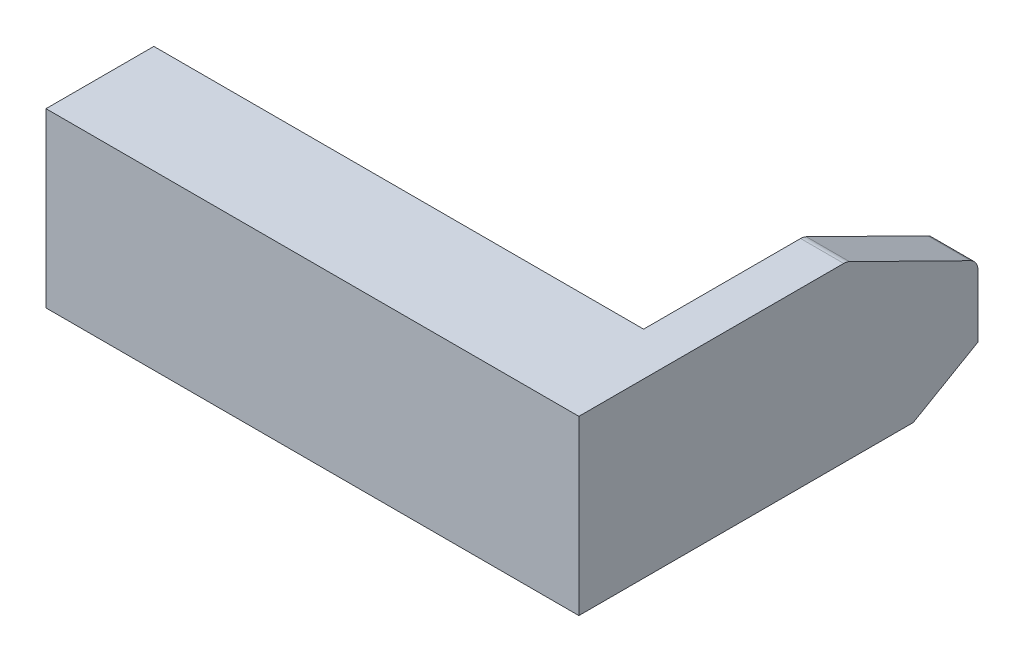
ISO-10303-21;
HEADER;
FILE_DESCRIPTION(('STEP AP214'),'2;1');
FILE_NAME('part.step','',(''),(''),'','','');
FILE_SCHEMA(('AUTOMOTIVE_DESIGN { 1 0 10303 214 1 1 1 1 }'));
ENDSEC;
DATA;
#1=APPLICATION_CONTEXT('core data for automotive mechanical design processes');
#2=APPLICATION_PROTOCOL_DEFINITION('international standard','automotive_design',2000,#1);
#3=PRODUCT_CONTEXT('',#1,'mechanical');
#4=PRODUCT('Part','Part','',(#3));
#5=PRODUCT_RELATED_PRODUCT_CATEGORY('part','',(#4));
#6=PRODUCT_DEFINITION_FORMATION('','',#4);
#7=PRODUCT_DEFINITION_CONTEXT('part definition',#1,'design');
#8=PRODUCT_DEFINITION('design','',#6,#7);
#9=PRODUCT_DEFINITION_SHAPE('','',#8);
#10=(LENGTH_UNIT() NAMED_UNIT(*) SI_UNIT(.MILLI.,.METRE.));
#11=(NAMED_UNIT(*) PLANE_ANGLE_UNIT() SI_UNIT($,.RADIAN.));
#12=(NAMED_UNIT(*) SI_UNIT($,.STERADIAN.) SOLID_ANGLE_UNIT());
#13=UNCERTAINTY_MEASURE_WITH_UNIT(LENGTH_MEASURE(1.E-05),#10,'distance_accuracy_value','');
#14=(GEOMETRIC_REPRESENTATION_CONTEXT(3) GLOBAL_UNCERTAINTY_ASSIGNED_CONTEXT((#13)) GLOBAL_UNIT_ASSIGNED_CONTEXT((#10,
#11,#12)) REPRESENTATION_CONTEXT('',''));
#15=CARTESIAN_POINT('',(0.,0.,0.));
#16=DIRECTION('',(0.,0.,1.));
#17=DIRECTION('',(1.,0.,0.));
#18=AXIS2_PLACEMENT_3D('',#15,#16,#17);
#19=CARTESIAN_POINT('',(0.,0.,0.));
#20=DIRECTION('',(1.,0.,0.));
#21=DIRECTION('',(0.,0.,-1.));
#22=AXIS2_PLACEMENT_3D('',#19,#20,#21);
#23=PLANE('',#22);
#24=CARTESIAN_POINT('',(0.,0.129573170731694,-35.5853658536586));
#25=DIRECTION('',(-1.,0.,0.));
#26=DIRECTION('',(0.,0.,1.));
#27=AXIS2_PLACEMENT_3D('',#24,#25,#26);
#28=CIRCLE('',#27,5.5);
#29=CARTESIAN_POINT('',(0.,0.129573170731694,-30.0853658536586));
#30=VERTEX_POINT('',#29);
#31=EDGE_CURVE('E242',#30,#30,#28,.T.);
#32=ORIENTED_EDGE('',*,*,#31,.F.);
#33=EDGE_LOOP('',(#32));
#34=FACE_BOUND('',#33,.T.);
#35=DIRECTION('',(0.,1.,0.));
#36=VECTOR('',#35,1.);
#37=CARTESIAN_POINT('',(0.,20.1295731707317,-56.5853658536586));
#38=LINE('',#37,#36);
#39=CARTESIAN_POINT('',(0.,-11.2101727914239,-56.5853658536586));
#40=VERTEX_POINT('',#39);
#41=CARTESIAN_POINT('',(0.,3.2640532905269,-56.5853658536586));
#42=VERTEX_POINT('',#41);
#43=EDGE_CURVE('E268',#40,#42,#38,.T.);
#44=ORIENTED_EDGE('',*,*,#43,.F.);
#45=DIRECTION('',(0.,0.499999999999998,-0.86602540378444));
#46=VECTOR('',#45,1.);
#47=CARTESIAN_POINT('',(0.,-11.2101727914239,-56.5853658536586));
#48=LINE('',#47,#46);
#49=CARTESIAN_POINT('',(0.,-19.8704268292683,-41.5853658536585));
#50=VERTEX_POINT('',#49);
#51=EDGE_CURVE('E79',#40,#50,#48,.F.);
#52=ORIENTED_EDGE('',*,*,#51,.T.);
#53=DIRECTION('',(0.,0.,-1.));
#54=VECTOR('',#53,1.);
#55=CARTESIAN_POINT('',(0.,-19.8704268292683,35.9146341463414));
#56=LINE('',#55,#54);
#57=CARTESIAN_POINT('',(0.,-19.8704268292683,10.9146341463414));
#58=VERTEX_POINT('',#57);
#59=EDGE_CURVE('E247',#58,#50,#56,.T.);
#60=ORIENTED_EDGE('',*,*,#59,.F.);
#61=DIRECTION('',(0.,-1.,0.));
#62=VECTOR('',#61,1.);
#63=CARTESIAN_POINT('',(0.,20.1295731707317,10.9146341463414));
#64=LINE('',#63,#62);
#65=CARTESIAN_POINT('',(0.,20.1295731707317,10.9146341463414));
#66=VERTEX_POINT('',#65);
#67=EDGE_CURVE('E180',#66,#58,#64,.T.);
#68=ORIENTED_EDGE('',*,*,#67,.F.);
#69=DIRECTION('',(0.,0.,1.));
#70=VECTOR('',#69,1.);
#71=CARTESIAN_POINT('',(0.,20.1295731707317,35.9146341463414));
#72=LINE('',#71,#70);
#73=CARTESIAN_POINT('',(0.,20.1295731707317,-25.4688729323097));
#74=VERTEX_POINT('',#73);
#75=EDGE_CURVE('E256',#74,#66,#72,.T.);
#76=ORIENTED_EDGE('',*,*,#75,.F.);
#77=CARTESIAN_POINT('',(0.,17.1295731707317,-25.4688729323097));
#78=DIRECTION('',(1.,0.,0.));
#79=DIRECTION('',(0.,0.,-1.));
#80=AXIS2_PLACEMENT_3D('',#77,#78,#79);
#81=CIRCLE('',#80,3.);
#82=CARTESIAN_POINT('',(0.,19.8201913953298,-26.7957390029667));
#83=VERTEX_POINT('',#82);
#84=EDGE_CURVE('E328',#74,#83,#81,.F.);
#85=ORIENTED_EDGE('',*,*,#84,.T.);
#86=DIRECTION('',(0.,0.442288690219003,0.896872741532688));
#87=VECTOR('',#86,1.);
#88=CARTESIAN_POINT('',(0.,20.1295731707317,-26.1683748238203));
#89=LINE('',#88,#87);
#90=CARTESIAN_POINT('',(0.,5.95467151512495,-54.9122319243156));
#91=VERTEX_POINT('',#90);
#92=EDGE_CURVE('E303',#83,#91,#89,.F.);
#93=ORIENTED_EDGE('',*,*,#92,.T.);
#94=CARTESIAN_POINT('',(0.,3.2640532905269,-53.5853658536586));
#95=DIRECTION('',(1.,0.,0.));
#96=DIRECTION('',(0.,0.,-1.));
#97=AXIS2_PLACEMENT_3D('',#94,#95,#96);
#98=CIRCLE('',#97,3.);
#99=EDGE_CURVE('E324',#91,#42,#98,.F.);
#100=ORIENTED_EDGE('',*,*,#99,.T.);
#101=EDGE_LOOP('',(#44,#52,#60,#68,#76,#85,#93,#100));
#102=FACE_BOUND('',#101,.T.);
#103=ADVANCED_FACE('F55',(#34,#102),#23,.F.);
#104=CARTESIAN_POINT('',(10.,20.1295731707317,35.9146341463414));
#105=DIRECTION('',(0.,0.,-1.));
#106=DIRECTION('',(0.,1.,0.));
#107=AXIS2_PLACEMENT_3D('',#104,#105,#106);
#108=PLANE('',#107);
#109=DIRECTION('',(-1.,0.,0.));
#110=VECTOR('',#109,1.);
#111=CARTESIAN_POINT('',(10.,20.1295731707317,35.9146341463414));
#112=LINE('',#111,#110);
#113=CARTESIAN_POINT('',(10.,20.1295731707317,35.9146341463414));
#114=VERTEX_POINT('',#113);
#115=CARTESIAN_POINT('',(-113.5,20.1295731707317,35.9146341463414));
#116=VERTEX_POINT('',#115);
#117=EDGE_CURVE('E265',#114,#116,#112,.T.);
#118=ORIENTED_EDGE('',*,*,#117,.T.);
#119=DIRECTION('',(0.,1.,0.));
#120=VECTOR('',#119,1.);
#121=CARTESIAN_POINT('',(-113.5,20.1295731707317,35.9146341463414));
#122=LINE('',#121,#120);
#123=CARTESIAN_POINT('',(-113.5,-19.8704268292683,35.9146341463414));
#124=VERTEX_POINT('',#123);
#125=EDGE_CURVE('E224',#124,#116,#122,.T.);
#126=ORIENTED_EDGE('',*,*,#125,.F.);
#127=DIRECTION('',(-1.,0.,0.));
#128=VECTOR('',#127,1.);
#129=CARTESIAN_POINT('',(10.,-19.8704268292683,35.9146341463414));
#130=LINE('',#129,#128);
#131=CARTESIAN_POINT('',(10.,-19.8704268292683,35.9146341463414));
#132=VERTEX_POINT('',#131);
#133=EDGE_CURVE('E275',#132,#124,#130,.T.);
#134=ORIENTED_EDGE('',*,*,#133,.F.);
#135=DIRECTION('',(0.,-1.,0.));
#136=VECTOR('',#135,1.);
#137=CARTESIAN_POINT('',(10.,20.1295731707317,35.9146341463414));
#138=LINE('',#137,#136);
#139=EDGE_CURVE('E251',#114,#132,#138,.T.);
#140=ORIENTED_EDGE('',*,*,#139,.F.);
#141=EDGE_LOOP('',(#118,#126,#134,#140));
#142=FACE_BOUND('',#141,.T.);
#143=ADVANCED_FACE('F387',(#142),#108,.F.);
#144=CARTESIAN_POINT('',(10.,-19.8704268292683,35.9146341463414));
#145=DIRECTION('',(0.,1.,0.));
#146=DIRECTION('',(0.,0.,1.));
#147=AXIS2_PLACEMENT_3D('',#144,#145,#146);
#148=PLANE('',#147);
#149=ORIENTED_EDGE('',*,*,#59,.T.);
#150=DIRECTION('',(1.,0.,0.));
#151=VECTOR('',#150,1.);
#152=CARTESIAN_POINT('',(10.,-19.8704268292683,-41.5853658536585));
#153=LINE('',#152,#151);
#154=CARTESIAN_POINT('',(10.,-19.8704268292683,-41.5853658536585));
#155=VERTEX_POINT('',#154);
#156=EDGE_CURVE('E65',#50,#155,#153,.T.);
#157=ORIENTED_EDGE('',*,*,#156,.T.);
#158=DIRECTION('',(0.,0.,-1.));
#159=VECTOR('',#158,1.);
#160=CARTESIAN_POINT('',(10.,-19.8704268292683,35.9146341463414));
#161=LINE('',#160,#159);
#162=EDGE_CURVE('E255',#132,#155,#161,.T.);
#163=ORIENTED_EDGE('',*,*,#162,.F.);
#164=ORIENTED_EDGE('',*,*,#133,.T.);
#165=DIRECTION('',(0.,0.,1.));
#166=VECTOR('',#165,1.);
#167=CARTESIAN_POINT('',(-113.5,-19.8704268292683,10.9146341463414));
#168=LINE('',#167,#166);
#169=CARTESIAN_POINT('',(-113.5,-19.8704268292683,10.9146341463414));
#170=VERTEX_POINT('',#169);
#171=EDGE_CURVE('E220',#170,#124,#168,.T.);
#172=ORIENTED_EDGE('',*,*,#171,.F.);
#173=DIRECTION('',(1.,0.,0.));
#174=VECTOR('',#173,1.);
#175=CARTESIAN_POINT('',(-113.5,-19.8704268292683,10.9146341463414));
#176=LINE('',#175,#174);
#177=EDGE_CURVE('E238',#170,#58,#176,.T.);
#178=ORIENTED_EDGE('',*,*,#177,.T.);
#179=EDGE_LOOP('',(#149,#157,#163,#164,#172,#178));
#180=FACE_BOUND('',#179,.T.);
#181=ADVANCED_FACE('F400',(#180),#148,.F.);
#182=CARTESIAN_POINT('',(10.,20.1295731707317,-56.5853658536586));
#183=DIRECTION('',(0.,0.,1.));
#184=DIRECTION('',(1.,0.,0.));
#185=AXIS2_PLACEMENT_3D('',#182,#183,#184);
#186=PLANE('',#185);
#187=DIRECTION('',(0.,1.,0.));
#188=VECTOR('',#187,1.);
#189=CARTESIAN_POINT('',(10.,20.1295731707317,-56.5853658536586));
#190=LINE('',#189,#188);
#191=CARTESIAN_POINT('',(10.,-11.2101727914239,-56.5853658536586));
#192=VERTEX_POINT('',#191);
#193=CARTESIAN_POINT('',(10.,3.2640532905269,-56.5853658536586));
#194=VERTEX_POINT('',#193);
#195=EDGE_CURVE('E259',#192,#194,#190,.T.);
#196=ORIENTED_EDGE('',*,*,#195,.F.);
#197=DIRECTION('',(-1.,0.,0.));
#198=VECTOR('',#197,1.);
#199=CARTESIAN_POINT('',(10.,-11.2101727914239,-56.5853658536586));
#200=LINE('',#199,#198);
#201=EDGE_CURVE('E347',#192,#40,#200,.T.);
#202=ORIENTED_EDGE('',*,*,#201,.T.);
#203=ORIENTED_EDGE('',*,*,#43,.T.);
#204=DIRECTION('',(-1.,0.,0.));
#205=VECTOR('',#204,1.);
#206=CARTESIAN_POINT('',(10.,3.2640532905269,-56.5853658536586));
#207=LINE('',#206,#205);
#208=EDGE_CURVE('E343',#42,#194,#207,.F.);
#209=ORIENTED_EDGE('',*,*,#208,.T.);
#210=EDGE_LOOP('',(#196,#202,#203,#209));
#211=FACE_BOUND('',#210,.T.);
#212=ADVANCED_FACE('F356',(#211),#186,.F.);
#213=CARTESIAN_POINT('',(10.,20.1295731707317,35.9146341463414));
#214=DIRECTION('',(0.,-1.,0.));
#215=DIRECTION('',(0.,0.,-1.));
#216=AXIS2_PLACEMENT_3D('',#213,#214,#215);
#217=PLANE('',#216);
#218=DIRECTION('',(0.,0.,1.));
#219=VECTOR('',#218,1.);
#220=CARTESIAN_POINT('',(10.,20.1295731707317,35.9146341463414));
#221=LINE('',#220,#219);
#222=CARTESIAN_POINT('',(10.,20.1295731707317,-25.4688729323097));
#223=VERTEX_POINT('',#222);
#224=EDGE_CURVE('E262',#223,#114,#221,.T.);
#225=ORIENTED_EDGE('',*,*,#224,.F.);
#226=DIRECTION('',(1.,0.,0.));
#227=VECTOR('',#226,1.);
#228=CARTESIAN_POINT('',(0.,20.1295731707317,-25.4688729323097));
#229=LINE('',#228,#227);
#230=EDGE_CURVE('E320',#223,#74,#229,.F.);
#231=ORIENTED_EDGE('',*,*,#230,.T.);
#232=ORIENTED_EDGE('',*,*,#75,.T.);
#233=DIRECTION('',(1.,0.,0.));
#234=VECTOR('',#233,1.);
#235=CARTESIAN_POINT('',(-113.5,20.1295731707317,10.9146341463414));
#236=LINE('',#235,#234);
#237=CARTESIAN_POINT('',(-113.5,20.1295731707317,10.9146341463414));
#238=VERTEX_POINT('',#237);
#239=EDGE_CURVE('E231',#238,#66,#236,.T.);
#240=ORIENTED_EDGE('',*,*,#239,.F.);
#241=DIRECTION('',(0.,0.,-1.));
#242=VECTOR('',#241,1.);
#243=CARTESIAN_POINT('',(-113.5,20.1295731707317,10.9146341463414));
#244=LINE('',#243,#242);
#245=EDGE_CURVE('E228',#116,#238,#244,.T.);
#246=ORIENTED_EDGE('',*,*,#245,.F.);
#247=ORIENTED_EDGE('',*,*,#117,.F.);
#248=EDGE_LOOP('',(#225,#231,#232,#240,#246,#247));
#249=FACE_BOUND('',#248,.T.);
#250=ADVANCED_FACE('F379',(#249),#217,.F.);
#251=CARTESIAN_POINT('',(10.,0.,0.));
#252=DIRECTION('',(1.,0.,0.));
#253=DIRECTION('',(0.,0.,-1.));
#254=AXIS2_PLACEMENT_3D('',#251,#252,#253);
#255=PLANE('',#254);
#256=ORIENTED_EDGE('',*,*,#162,.T.);
#257=DIRECTION('',(0.,-0.499999999999998,0.86602540378444));
#258=VECTOR('',#257,1.);
#259=CARTESIAN_POINT('',(10.,-32.9098117494203,-19.0004886725076));
#260=LINE('',#259,#258);
#261=EDGE_CURVE('E11',#155,#192,#260,.F.);
#262=ORIENTED_EDGE('',*,*,#261,.T.);
#263=ORIENTED_EDGE('',*,*,#195,.T.);
#264=CARTESIAN_POINT('',(10.,3.2640532905269,-53.5853658536586));
#265=DIRECTION('',(1.,0.,0.));
#266=DIRECTION('',(0.,0.,-1.));
#267=AXIS2_PLACEMENT_3D('',#264,#265,#266);
#268=CIRCLE('',#267,3.);
#269=CARTESIAN_POINT('',(10.,5.95467151512495,-54.9122319243156));
#270=VERTEX_POINT('',#269);
#271=EDGE_CURVE('E337',#194,#270,#268,.T.);
#272=ORIENTED_EDGE('',*,*,#271,.T.);
#273=DIRECTION('',(0.,-0.442288690219003,-0.896872741532688));
#274=VECTOR('',#273,1.);
#275=CARTESIAN_POINT('',(10.,26.5722242379764,-13.1039708424363));
#276=LINE('',#275,#274);
#277=CARTESIAN_POINT('',(10.,19.8201913953298,-26.7957390029667));
#278=VERTEX_POINT('',#277);
#279=EDGE_CURVE('E316',#270,#278,#276,.F.);
#280=ORIENTED_EDGE('',*,*,#279,.T.);
#281=CARTESIAN_POINT('',(10.,17.1295731707317,-25.4688729323097));
#282=DIRECTION('',(1.,0.,0.));
#283=DIRECTION('',(0.,0.,-1.));
#284=AXIS2_PLACEMENT_3D('',#281,#282,#283);
#285=CIRCLE('',#284,3.);
#286=EDGE_CURVE('E340',#278,#223,#285,.T.);
#287=ORIENTED_EDGE('',*,*,#286,.T.);
#288=ORIENTED_EDGE('',*,*,#224,.T.);
#289=ORIENTED_EDGE('',*,*,#139,.T.);
#290=EDGE_LOOP('',(#256,#262,#263,#272,#280,#287,#288,#289));
#291=FACE_BOUND('',#290,.T.);
#292=ADVANCED_FACE('F368',(#291),#255,.T.);
#293=CARTESIAN_POINT('',(8.5,0.129573170731694,-35.5853658536586));
#294=DIRECTION('',(-1.,0.,0.));
#295=DIRECTION('',(0.,0.,1.));
#296=AXIS2_PLACEMENT_3D('',#293,#294,#295);
#297=CYLINDRICAL_SURFACE('',#296,5.5);
#298=CARTESIAN_POINT('',(8.5,0.129573170731694,-35.5853658536586));
#299=DIRECTION('',(-1.,0.,0.));
#300=DIRECTION('',(0.,0.,1.));
#301=AXIS2_PLACEMENT_3D('',#298,#299,#300);
#302=CIRCLE('',#301,5.5);
#303=CARTESIAN_POINT('',(8.5,0.129573170731694,-30.0853658536586));
#304=VERTEX_POINT('',#303);
#305=EDGE_CURVE('E243',#304,#304,#302,.T.);
#306=ORIENTED_EDGE('',*,*,#305,.F.);
#307=EDGE_LOOP('',(#306));
#308=FACE_BOUND('',#307,.T.);
#309=ORIENTED_EDGE('',*,*,#31,.T.);
#310=EDGE_LOOP('',(#309));
#311=FACE_BOUND('',#310,.T.);
#312=ADVANCED_FACE('F440',(#308,#311),#297,.F.);
#313=CARTESIAN_POINT('',(8.5,0.129573170731694,-35.5853658536586));
#314=DIRECTION('',(-1.,0.,0.));
#315=DIRECTION('',(0.,0.,1.));
#316=AXIS2_PLACEMENT_3D('',#313,#314,#315);
#317=PLANE('',#316);
#318=ORIENTED_EDGE('',*,*,#305,.T.);
#319=EDGE_LOOP('',(#318));
#320=FACE_BOUND('',#319,.T.);
#321=ADVANCED_FACE('F434',(#320),#317,.T.);
#322=CARTESIAN_POINT('',(-113.5,0.,0.));
#323=DIRECTION('',(-1.,0.,0.));
#324=DIRECTION('',(0.,0.,1.));
#325=AXIS2_PLACEMENT_3D('',#322,#323,#324);
#326=PLANE('',#325);
#327=DIRECTION('',(0.,1.,0.));
#328=VECTOR('',#327,1.);
#329=CARTESIAN_POINT('',(-113.5,0.,31.5396341463414));
#330=LINE('',#329,#328);
#331=CARTESIAN_POINT('',(-113.5,15.7545731707317,31.5396341463414));
#332=VERTEX_POINT('',#331);
#333=CARTESIAN_POINT('',(-113.5,-15.4954268292683,31.5396341463414));
#334=VERTEX_POINT('',#333);
#335=EDGE_CURVE('E288',#332,#334,#330,.F.);
#336=ORIENTED_EDGE('',*,*,#335,.T.);
#337=DIRECTION('',(0.,0.,1.));
#338=VECTOR('',#337,1.);
#339=CARTESIAN_POINT('',(-113.5,-15.4954268292683,0.));
#340=LINE('',#339,#338);
#341=CARTESIAN_POINT('',(-113.5,-15.4954268292683,15.2896341463414));
#342=VERTEX_POINT('',#341);
#343=EDGE_CURVE('E291',#334,#342,#340,.F.);
#344=ORIENTED_EDGE('',*,*,#343,.T.);
#345=DIRECTION('',(0.,-1.,0.));
#346=VECTOR('',#345,1.);
#347=CARTESIAN_POINT('',(-113.5,0.,15.2896341463414));
#348=LINE('',#347,#346);
#349=CARTESIAN_POINT('',(-113.5,15.7545731707317,15.2896341463414));
#350=VERTEX_POINT('',#349);
#351=EDGE_CURVE('E282',#342,#350,#348,.F.);
#352=ORIENTED_EDGE('',*,*,#351,.T.);
#353=DIRECTION('',(0.,0.,-1.));
#354=VECTOR('',#353,1.);
#355=CARTESIAN_POINT('',(-113.5,15.7545731707317,0.));
#356=LINE('',#355,#354);
#357=EDGE_CURVE('E285',#350,#332,#356,.F.);
#358=ORIENTED_EDGE('',*,*,#357,.T.);
#359=EDGE_LOOP('',(#336,#344,#352,#358));
#360=FACE_BOUND('',#359,.T.);
#361=DIRECTION('',(0.,-1.,0.));
#362=VECTOR('',#361,1.);
#363=CARTESIAN_POINT('',(-113.5,20.1295731707317,10.9146341463414));
#364=LINE('',#363,#362);
#365=EDGE_CURVE('E216',#238,#170,#364,.T.);
#366=ORIENTED_EDGE('',*,*,#365,.T.);
#367=ORIENTED_EDGE('',*,*,#171,.T.);
#368=ORIENTED_EDGE('',*,*,#125,.T.);
#369=ORIENTED_EDGE('',*,*,#245,.T.);
#370=EDGE_LOOP('',(#366,#367,#368,#369));
#371=FACE_BOUND('',#370,.T.);
#372=ADVANCED_FACE('F432',(#360,#371),#326,.T.);
#373=CARTESIAN_POINT('',(-113.5,20.1295731707317,10.9146341463414));
#374=DIRECTION('',(0.,0.,1.));
#375=DIRECTION('',(0.,-1.,0.));
#376=AXIS2_PLACEMENT_3D('',#373,#374,#375);
#377=PLANE('',#376);
#378=ORIENTED_EDGE('',*,*,#67,.T.);
#379=ORIENTED_EDGE('',*,*,#177,.F.);
#380=ORIENTED_EDGE('',*,*,#365,.F.);
#381=ORIENTED_EDGE('',*,*,#239,.T.);
#382=EDGE_LOOP('',(#378,#379,#380,#381));
#383=FACE_BOUND('',#382,.T.);
#384=ADVANCED_FACE('F431',(#383),#377,.F.);
#385=CARTESIAN_POINT('',(-113.5,12.7545731707317,18.2896341463414));
#386=DIRECTION('',(0.,-1.,0.));
#387=DIRECTION('',(0.,0.,-1.));
#388=AXIS2_PLACEMENT_3D('',#385,#386,#387);
#389=PLANE('',#388);
#390=DIRECTION('',(1.,0.,0.));
#391=VECTOR('',#390,1.);
#392=CARTESIAN_POINT('',(-113.5,12.7545731707317,28.5396341463414));
#393=LINE('',#392,#391);
#394=CARTESIAN_POINT('',(-110.5,12.7545731707317,28.5396341463414));
#395=VERTEX_POINT('',#394);
#396=CARTESIAN_POINT('',(0.,12.7545731707317,28.5396341463414));
#397=VERTEX_POINT('',#396);
#398=EDGE_CURVE('E208',#395,#397,#393,.T.);
#399=ORIENTED_EDGE('',*,*,#398,.F.);
#400=DIRECTION('',(0.,0.,-1.));
#401=VECTOR('',#400,1.);
#402=CARTESIAN_POINT('',(-110.5,12.7545731707317,18.2896341463414));
#403=LINE('',#402,#401);
#404=CARTESIAN_POINT('',(-110.5,12.7545731707317,18.2896341463414));
#405=VERTEX_POINT('',#404);
#406=EDGE_CURVE('E176',#395,#405,#403,.T.);
#407=ORIENTED_EDGE('',*,*,#406,.T.);
#408=DIRECTION('',(1.,0.,0.));
#409=VECTOR('',#408,1.);
#410=CARTESIAN_POINT('',(-113.5,12.7545731707317,18.2896341463414));
#411=LINE('',#410,#409);
#412=CARTESIAN_POINT('',(0.,12.7545731707317,18.2896341463414));
#413=VERTEX_POINT('',#412);
#414=EDGE_CURVE('E168',#405,#413,#411,.T.);
#415=ORIENTED_EDGE('',*,*,#414,.T.);
#416=DIRECTION('',(0.,0.,-1.));
#417=VECTOR('',#416,1.);
#418=CARTESIAN_POINT('',(0.,12.7545731707317,18.2896341463414));
#419=LINE('',#418,#417);
#420=EDGE_CURVE('E173',#397,#413,#419,.T.);
#421=ORIENTED_EDGE('',*,*,#420,.F.);
#422=EDGE_LOOP('',(#399,#407,#415,#421));
#423=FACE_BOUND('',#422,.T.);
#424=ADVANCED_FACE('F171',(#423),#389,.T.);
#425=CARTESIAN_POINT('',(-113.5,12.7545731707317,18.2896341463414));
#426=DIRECTION('',(0.,0.,1.));
#427=DIRECTION('',(0.,-1.,0.));
#428=AXIS2_PLACEMENT_3D('',#425,#426,#427);
#429=PLANE('',#428);
#430=ORIENTED_EDGE('',*,*,#414,.F.);
#431=DIRECTION('',(0.,-1.,0.));
#432=VECTOR('',#431,1.);
#433=CARTESIAN_POINT('',(-110.5,12.7545731707317,18.2896341463414));
#434=LINE('',#433,#432);
#435=CARTESIAN_POINT('',(-110.5,-12.4954268292683,18.2896341463414));
#436=VERTEX_POINT('',#435);
#437=EDGE_CURVE('E300',#405,#436,#434,.T.);
#438=ORIENTED_EDGE('',*,*,#437,.T.);
#439=DIRECTION('',(1.,0.,0.));
#440=VECTOR('',#439,1.);
#441=CARTESIAN_POINT('',(-113.5,-12.4954268292683,18.2896341463414));
#442=LINE('',#441,#440);
#443=CARTESIAN_POINT('',(0.,-12.4954268292683,18.2896341463414));
#444=VERTEX_POINT('',#443);
#445=EDGE_CURVE('E181',#436,#444,#442,.T.);
#446=ORIENTED_EDGE('',*,*,#445,.T.);
#447=DIRECTION('',(0.,-1.,0.));
#448=VECTOR('',#447,1.);
#449=CARTESIAN_POINT('',(0.,12.7545731707317,18.2896341463414));
#450=LINE('',#449,#448);
#451=EDGE_CURVE('E184',#413,#444,#450,.T.);
#452=ORIENTED_EDGE('',*,*,#451,.F.);
#453=EDGE_LOOP('',(#430,#438,#446,#452));
#454=FACE_BOUND('',#453,.T.);
#455=ADVANCED_FACE('F185',(#454),#429,.T.);
#456=CARTESIAN_POINT('',(-113.5,-12.4954268292683,18.2896341463414));
#457=DIRECTION('',(0.,1.,0.));
#458=DIRECTION('',(0.,0.,1.));
#459=AXIS2_PLACEMENT_3D('',#456,#457,#458);
#460=PLANE('',#459);
#461=ORIENTED_EDGE('',*,*,#445,.F.);
#462=DIRECTION('',(0.,0.,1.));
#463=VECTOR('',#462,1.);
#464=CARTESIAN_POINT('',(-110.5,-12.4954268292683,18.2896341463414));
#465=LINE('',#464,#463);
#466=CARTESIAN_POINT('',(-110.5,-12.4954268292683,28.5396341463414));
#467=VERTEX_POINT('',#466);
#468=EDGE_CURVE('E278',#436,#467,#465,.T.);
#469=ORIENTED_EDGE('',*,*,#468,.T.);
#470=DIRECTION('',(1.,0.,0.));
#471=VECTOR('',#470,1.);
#472=CARTESIAN_POINT('',(-113.5,-12.4954268292683,28.5396341463414));
#473=LINE('',#472,#471);
#474=CARTESIAN_POINT('',(0.,-12.4954268292683,28.5396341463414));
#475=VERTEX_POINT('',#474);
#476=EDGE_CURVE('E211',#467,#475,#473,.T.);
#477=ORIENTED_EDGE('',*,*,#476,.T.);
#478=DIRECTION('',(0.,0.,1.));
#479=VECTOR('',#478,1.);
#480=CARTESIAN_POINT('',(0.,-12.4954268292683,18.2896341463414));
#481=LINE('',#480,#479);
#482=EDGE_CURVE('E191',#444,#475,#481,.T.);
#483=ORIENTED_EDGE('',*,*,#482,.F.);
#484=EDGE_LOOP('',(#461,#469,#477,#483));
#485=FACE_BOUND('',#484,.T.);
#486=ADVANCED_FACE('F417',(#485),#460,.T.);
#487=CARTESIAN_POINT('',(-113.5,12.7545731707317,28.5396341463414));
#488=DIRECTION('',(0.,0.,-1.));
#489=DIRECTION('',(0.,1.,0.));
#490=AXIS2_PLACEMENT_3D('',#487,#488,#489);
#491=PLANE('',#490);
#492=ORIENTED_EDGE('',*,*,#476,.F.);
#493=DIRECTION('',(0.,1.,0.));
#494=VECTOR('',#493,1.);
#495=CARTESIAN_POINT('',(-110.5,12.7545731707317,28.5396341463414));
#496=LINE('',#495,#494);
#497=EDGE_CURVE('E295',#467,#395,#496,.T.);
#498=ORIENTED_EDGE('',*,*,#497,.T.);
#499=ORIENTED_EDGE('',*,*,#398,.T.);
#500=DIRECTION('',(0.,1.,0.));
#501=VECTOR('',#500,1.);
#502=CARTESIAN_POINT('',(0.,12.7545731707317,28.5396341463414));
#503=LINE('',#502,#501);
#504=EDGE_CURVE('E195',#475,#397,#503,.T.);
#505=ORIENTED_EDGE('',*,*,#504,.F.);
#506=EDGE_LOOP('',(#492,#498,#499,#505));
#507=FACE_BOUND('',#506,.T.);
#508=ADVANCED_FACE('F407',(#507),#491,.T.);
#509=ORIENTED_EDGE('',*,*,#504,.T.);
#510=ORIENTED_EDGE('',*,*,#420,.T.);
#511=ORIENTED_EDGE('',*,*,#451,.T.);
#512=ORIENTED_EDGE('',*,*,#482,.T.);
#513=EDGE_LOOP('',(#509,#510,#511,#512));
#514=FACE_BOUND('',#513,.T.);
#515=ADVANCED_FACE('F193',(#514),#23,.F.);
#516=CARTESIAN_POINT('',(-110.5,15.7545731707317,18.2896341463414));
#517=DIRECTION('',(0.,0.,-1.));
#518=DIRECTION('',(-1.,0.,0.));
#519=AXIS2_PLACEMENT_3D('',#516,#517,#518);
#520=CYLINDRICAL_SURFACE('',#519,3.);
#521=CARTESIAN_POINT('',(-110.5,15.7545731707317,31.5396341463414));
#522=DIRECTION('',(0.,0.707106781186547,-0.707106781186548));
#523=DIRECTION('',(0.,0.707106781186548,0.707106781186547));
#524=AXIS2_PLACEMENT_3D('',#521,#522,#523);
#525=ELLIPSE('',#524,4.24264068711928,3.);
#526=EDGE_CURVE('E201',#332,#395,#525,.F.);
#527=ORIENTED_EDGE('',*,*,#526,.F.);
#528=ORIENTED_EDGE('',*,*,#357,.F.);
#529=CARTESIAN_POINT('',(-110.5,15.7545731707317,15.2896341463414));
#530=DIRECTION('',(0.,-0.707106781186548,-0.707106781186547));
#531=DIRECTION('',(0.,0.707106781186547,-0.707106781186548));
#532=AXIS2_PLACEMENT_3D('',#529,#530,#531);
#533=ELLIPSE('',#532,4.24264068711929,3.);
#534=EDGE_CURVE('E197',#405,#350,#533,.T.);
#535=ORIENTED_EDGE('',*,*,#534,.F.);
#536=ORIENTED_EDGE('',*,*,#406,.F.);
#537=EDGE_LOOP('',(#527,#528,#535,#536));
#538=FACE_BOUND('',#537,.T.);
#539=ADVANCED_FACE('F406',(#538),#520,.T.);
#540=CARTESIAN_POINT('',(-110.5,12.7545731707317,15.2896341463414));
#541=DIRECTION('',(0.,-1.,0.));
#542=DIRECTION('',(0.,0.,-1.));
#543=AXIS2_PLACEMENT_3D('',#540,#541,#542);
#544=CYLINDRICAL_SURFACE('',#543,3.);
#545=ORIENTED_EDGE('',*,*,#534,.T.);
#546=ORIENTED_EDGE('',*,*,#351,.F.);
#547=CARTESIAN_POINT('',(-110.5,-15.4954268292683,15.2896341463414));
#548=DIRECTION('',(0.,-0.707106781186547,0.707106781186548));
#549=DIRECTION('',(0.,0.707106781186548,0.707106781186547));
#550=AXIS2_PLACEMENT_3D('',#547,#548,#549);
#551=ELLIPSE('',#550,4.24264068711928,3.);
#552=EDGE_CURVE('E307',#436,#342,#551,.T.);
#553=ORIENTED_EDGE('',*,*,#552,.F.);
#554=ORIENTED_EDGE('',*,*,#437,.F.);
#555=EDGE_LOOP('',(#545,#546,#553,#554));
#556=FACE_BOUND('',#555,.T.);
#557=ADVANCED_FACE('F413',(#556),#544,.T.);
#558=CARTESIAN_POINT('',(-110.5,12.7545731707317,31.5396341463414));
#559=DIRECTION('',(0.,1.,0.));
#560=DIRECTION('',(0.,0.,1.));
#561=AXIS2_PLACEMENT_3D('',#558,#559,#560);
#562=CYLINDRICAL_SURFACE('',#561,3.);
#563=ORIENTED_EDGE('',*,*,#526,.T.);
#564=ORIENTED_EDGE('',*,*,#497,.F.);
#565=CARTESIAN_POINT('',(-110.5,-15.4954268292683,31.5396341463414));
#566=DIRECTION('',(0.,0.707106781186548,0.707106781186547));
#567=DIRECTION('',(0.,-0.707106781186547,0.707106781186548));
#568=AXIS2_PLACEMENT_3D('',#565,#566,#567);
#569=ELLIPSE('',#568,4.24264068711929,3.);
#570=EDGE_CURVE('E304',#334,#467,#569,.F.);
#571=ORIENTED_EDGE('',*,*,#570,.F.);
#572=ORIENTED_EDGE('',*,*,#335,.F.);
#573=EDGE_LOOP('',(#563,#564,#571,#572));
#574=FACE_BOUND('',#573,.T.);
#575=ADVANCED_FACE('F458',(#574),#562,.T.);
#576=CARTESIAN_POINT('',(-110.5,-15.4954268292683,18.2896341463414));
#577=DIRECTION('',(0.,0.,1.));
#578=DIRECTION('',(1.,0.,0.));
#579=AXIS2_PLACEMENT_3D('',#576,#577,#578);
#580=CYLINDRICAL_SURFACE('',#579,3.);
#581=ORIENTED_EDGE('',*,*,#552,.T.);
#582=ORIENTED_EDGE('',*,*,#343,.F.);
#583=ORIENTED_EDGE('',*,*,#570,.T.);
#584=ORIENTED_EDGE('',*,*,#468,.F.);
#585=EDGE_LOOP('',(#581,#582,#583,#584));
#586=FACE_BOUND('',#585,.T.);
#587=ADVANCED_FACE('F456',(#586),#580,.T.);
#588=CARTESIAN_POINT('',(10.,20.1295731707317,-26.1683748238203));
#589=DIRECTION('',(0.,-0.896872741532688,0.442288690219002));
#590=DIRECTION('',(-1.,0.,0.));
#591=AXIS2_PLACEMENT_3D('',#588,#589,#590);
#592=PLANE('',#591);
#593=ORIENTED_EDGE('',*,*,#92,.F.);
#594=DIRECTION('',(-1.,0.,0.));
#595=VECTOR('',#594,1.);
#596=CARTESIAN_POINT('',(10.,19.8201913953298,-26.7957390029667));
#597=LINE('',#596,#595);
#598=EDGE_CURVE('E334',#83,#278,#597,.F.);
#599=ORIENTED_EDGE('',*,*,#598,.T.);
#600=ORIENTED_EDGE('',*,*,#279,.F.);
#601=DIRECTION('',(1.,0.,0.));
#602=VECTOR('',#601,1.);
#603=CARTESIAN_POINT('',(0.,5.95467151512496,-54.9122319243156));
#604=LINE('',#603,#602);
#605=EDGE_CURVE('E331',#270,#91,#604,.F.);
#606=ORIENTED_EDGE('',*,*,#605,.T.);
#607=EDGE_LOOP('',(#593,#599,#600,#606));
#608=FACE_BOUND('',#607,.T.);
#609=ADVANCED_FACE('F371',(#608),#592,.F.);
#610=CARTESIAN_POINT('',(10.,17.1295731707317,-25.4688729323097));
#611=DIRECTION('',(-1.,0.,0.));
#612=DIRECTION('',(0.,0.,1.));
#613=AXIS2_PLACEMENT_3D('',#610,#611,#612);
#614=CYLINDRICAL_SURFACE('',#613,3.);
#615=ORIENTED_EDGE('',*,*,#286,.F.);
#616=ORIENTED_EDGE('',*,*,#598,.F.);
#617=ORIENTED_EDGE('',*,*,#84,.F.);
#618=ORIENTED_EDGE('',*,*,#230,.F.);
#619=EDGE_LOOP('',(#615,#616,#617,#618));
#620=FACE_BOUND('',#619,.T.);
#621=ADVANCED_FACE('F374',(#620),#614,.T.);
#622=CARTESIAN_POINT('',(10.,3.2640532905269,-53.5853658536586));
#623=DIRECTION('',(1.,0.,0.));
#624=DIRECTION('',(0.,0.,-1.));
#625=AXIS2_PLACEMENT_3D('',#622,#623,#624);
#626=CYLINDRICAL_SURFACE('',#625,3.);
#627=ORIENTED_EDGE('',*,*,#99,.F.);
#628=ORIENTED_EDGE('',*,*,#605,.F.);
#629=ORIENTED_EDGE('',*,*,#271,.F.);
#630=ORIENTED_EDGE('',*,*,#208,.F.);
#631=EDGE_LOOP('',(#627,#628,#629,#630));
#632=FACE_BOUND('',#631,.T.);
#633=ADVANCED_FACE('F365',(#632),#626,.T.);
#634=CARTESIAN_POINT('',(10.,-11.2101727914239,-56.5853658536586));
#635=DIRECTION('',(0.,0.86602540378444,0.499999999999998));
#636=DIRECTION('',(-1.,0.,0.));
#637=AXIS2_PLACEMENT_3D('',#634,#635,#636);
#638=PLANE('',#637);
#639=ORIENTED_EDGE('',*,*,#261,.F.);
#640=ORIENTED_EDGE('',*,*,#156,.F.);
#641=ORIENTED_EDGE('',*,*,#51,.F.);
#642=ORIENTED_EDGE('',*,*,#201,.F.);
#643=EDGE_LOOP('',(#639,#640,#641,#642));
#644=FACE_BOUND('',#643,.T.);
#645=ADVANCED_FACE('F58',(#644),#638,.F.);
#646=CLOSED_SHELL('',(#103,#143,#181,#212,#250,#292,#312,#321,#372,#384,#424,#455,#486,#508,
#515,#539,#557,#575,#587,#609,#621,#633,#645));
#647=MANIFOLD_SOLID_BREP('B2',#646);
#648=ADVANCED_BREP_SHAPE_REPRESENTATION('',(#18,#647),#14);
#649=SHAPE_DEFINITION_REPRESENTATION(#9,#648);
ENDSEC;
END-ISO-10303-21;
